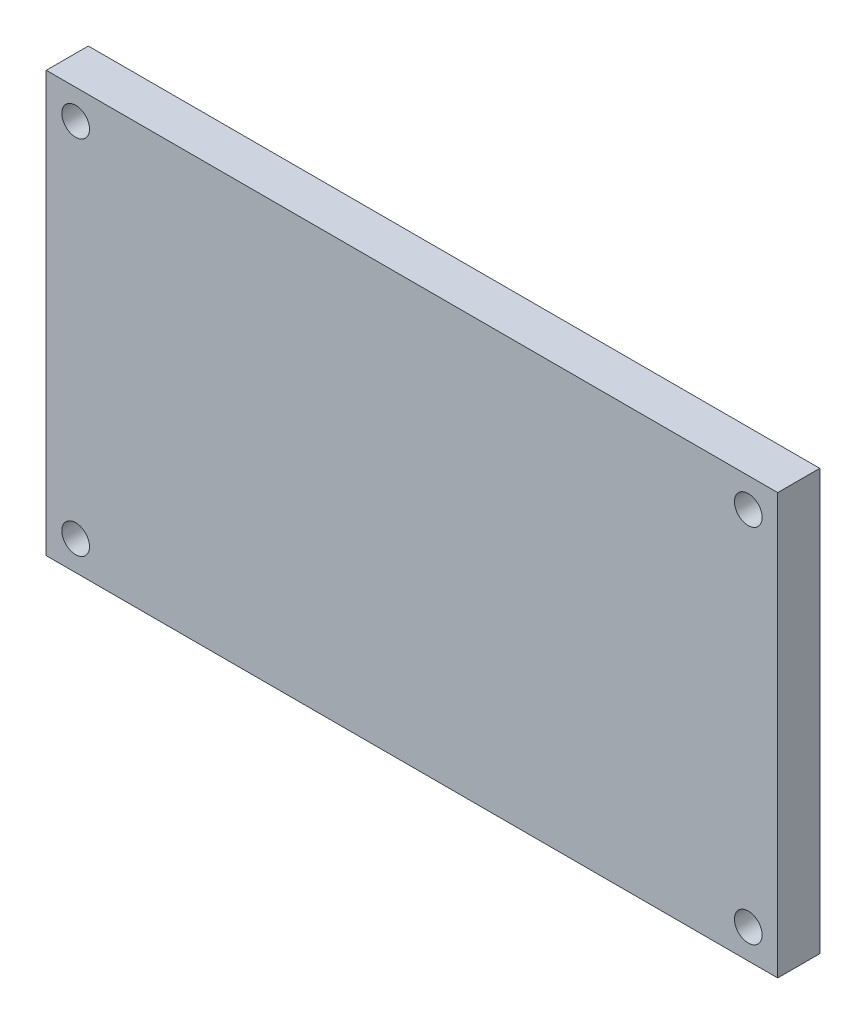
ISO-10303-21;
HEADER;
FILE_DESCRIPTION(('STEP AP214'),'2;1');
FILE_NAME('part.step','',(''),(''),'','','');
FILE_SCHEMA(('AUTOMOTIVE_DESIGN { 1 0 10303 214 1 1 1 1 }'));
ENDSEC;
DATA;
#1=APPLICATION_CONTEXT('core data for automotive mechanical design processes');
#2=APPLICATION_PROTOCOL_DEFINITION('international standard','automotive_design',2000,#1);
#3=PRODUCT_CONTEXT('',#1,'mechanical');
#4=PRODUCT('Part','Part','',(#3));
#5=PRODUCT_RELATED_PRODUCT_CATEGORY('part','',(#4));
#6=PRODUCT_DEFINITION_FORMATION('','',#4);
#7=PRODUCT_DEFINITION_CONTEXT('part definition',#1,'design');
#8=PRODUCT_DEFINITION('design','',#6,#7);
#9=PRODUCT_DEFINITION_SHAPE('','',#8);
#10=(LENGTH_UNIT() NAMED_UNIT(*) SI_UNIT(.MILLI.,.METRE.));
#11=(NAMED_UNIT(*) PLANE_ANGLE_UNIT() SI_UNIT($,.RADIAN.));
#12=(NAMED_UNIT(*) SI_UNIT($,.STERADIAN.) SOLID_ANGLE_UNIT());
#13=UNCERTAINTY_MEASURE_WITH_UNIT(LENGTH_MEASURE(1.E-05),#10,'distance_accuracy_value','');
#14=(GEOMETRIC_REPRESENTATION_CONTEXT(3) GLOBAL_UNCERTAINTY_ASSIGNED_CONTEXT((#13)) GLOBAL_UNIT_ASSIGNED_CONTEXT((#10,
#11,#12)) REPRESENTATION_CONTEXT('',''));
#15=CARTESIAN_POINT('',(0.,0.,0.));
#16=DIRECTION('',(0.,0.,1.));
#17=DIRECTION('',(1.,0.,0.));
#18=AXIS2_PLACEMENT_3D('',#15,#16,#17);
#19=CARTESIAN_POINT('',(0.,0.,5.));
#20=DIRECTION('',(0.,0.,-1.));
#21=DIRECTION('',(-1.,0.,0.));
#22=AXIS2_PLACEMENT_3D('',#19,#20,#21);
#23=PLANE('',#22);
#24=DIRECTION('',(0.,1.,0.));
#25=VECTOR('',#24,1.);
#26=CARTESIAN_POINT('',(43.5,-25.,5.));
#27=LINE('',#26,#25);
#28=CARTESIAN_POINT('',(43.5,-25.,5.));
#29=VERTEX_POINT('',#28);
#30=CARTESIAN_POINT('',(43.5,25.,5.));
#31=VERTEX_POINT('',#30);
#32=EDGE_CURVE('E96',#29,#31,#27,.T.);
#33=ORIENTED_EDGE('',*,*,#32,.T.);
#34=DIRECTION('',(-1.,0.,0.));
#35=VECTOR('',#34,1.);
#36=CARTESIAN_POINT('',(-43.5,25.,5.));
#37=LINE('',#36,#35);
#38=CARTESIAN_POINT('',(-43.5,25.,5.));
#39=VERTEX_POINT('',#38);
#40=EDGE_CURVE('E91',#31,#39,#37,.T.);
#41=ORIENTED_EDGE('',*,*,#40,.T.);
#42=DIRECTION('',(0.,-1.,0.));
#43=VECTOR('',#42,1.);
#44=CARTESIAN_POINT('',(-43.5,-25.,5.));
#45=LINE('',#44,#43);
#46=CARTESIAN_POINT('',(-43.5,-25.,5.));
#47=VERTEX_POINT('',#46);
#48=EDGE_CURVE('E94',#39,#47,#45,.T.);
#49=ORIENTED_EDGE('',*,*,#48,.T.);
#50=DIRECTION('',(1.,0.,0.));
#51=VECTOR('',#50,1.);
#52=CARTESIAN_POINT('',(-43.5,-25.,5.));
#53=LINE('',#52,#51);
#54=EDGE_CURVE('E61',#47,#29,#53,.T.);
#55=ORIENTED_EDGE('',*,*,#54,.T.);
#56=EDGE_LOOP('',(#33,#41,#49,#55));
#57=FACE_BOUND('',#56,.T.);
#58=CARTESIAN_POINT('',(40.,21.5,5.));
#59=DIRECTION('',(0.,0.,1.));
#60=DIRECTION('',(1.,0.,0.));
#61=AXIS2_PLACEMENT_3D('',#58,#59,#60);
#62=CIRCLE('',#61,1.65);
#63=CARTESIAN_POINT('',(41.65,21.5,5.));
#64=VERTEX_POINT('',#63);
#65=EDGE_CURVE('E116',#64,#64,#62,.T.);
#66=ORIENTED_EDGE('',*,*,#65,.F.);
#67=EDGE_LOOP('',(#66));
#68=FACE_BOUND('',#67,.T.);
#69=CARTESIAN_POINT('',(40.,-21.5,5.));
#70=DIRECTION('',(0.,0.,1.));
#71=DIRECTION('',(1.,0.,0.));
#72=AXIS2_PLACEMENT_3D('',#69,#70,#71);
#73=CIRCLE('',#72,1.65);
#74=CARTESIAN_POINT('',(41.65,-21.5,5.));
#75=VERTEX_POINT('',#74);
#76=EDGE_CURVE('E138',#75,#75,#73,.T.);
#77=ORIENTED_EDGE('',*,*,#76,.F.);
#78=EDGE_LOOP('',(#77));
#79=FACE_BOUND('',#78,.T.);
#80=CARTESIAN_POINT('',(-40.,-21.5,5.));
#81=DIRECTION('',(0.,0.,1.));
#82=DIRECTION('',(1.,0.,0.));
#83=AXIS2_PLACEMENT_3D('',#80,#81,#82);
#84=CIRCLE('',#83,1.65);
#85=CARTESIAN_POINT('',(-38.35,-21.5,5.));
#86=VERTEX_POINT('',#85);
#87=EDGE_CURVE('E146',#86,#86,#84,.T.);
#88=ORIENTED_EDGE('',*,*,#87,.F.);
#89=EDGE_LOOP('',(#88));
#90=FACE_BOUND('',#89,.T.);
#91=CARTESIAN_POINT('',(-40.,21.5,5.));
#92=DIRECTION('',(0.,0.,1.));
#93=DIRECTION('',(1.,0.,0.));
#94=AXIS2_PLACEMENT_3D('',#91,#92,#93);
#95=CIRCLE('',#94,1.65);
#96=CARTESIAN_POINT('',(-38.35,21.5,5.));
#97=VERTEX_POINT('',#96);
#98=EDGE_CURVE('E154',#97,#97,#95,.T.);
#99=ORIENTED_EDGE('',*,*,#98,.F.);
#100=EDGE_LOOP('',(#99));
#101=FACE_BOUND('',#100,.T.);
#102=ADVANCED_FACE('F43',(#57,#68,#79,#90,#101),#23,.F.);
#103=CARTESIAN_POINT('',(0.,0.,0.));
#104=DIRECTION('',(0.,0.,-1.));
#105=DIRECTION('',(-1.,0.,0.));
#106=AXIS2_PLACEMENT_3D('',#103,#104,#105);
#107=PLANE('',#106);
#108=CARTESIAN_POINT('',(-40.,-21.5,0.));
#109=DIRECTION('',(0.,0.,1.));
#110=DIRECTION('',(1.,0.,0.));
#111=AXIS2_PLACEMENT_3D('',#108,#109,#110);
#112=CIRCLE('',#111,1.65);
#113=CARTESIAN_POINT('',(-38.35,-21.5,0.));
#114=VERTEX_POINT('',#113);
#115=EDGE_CURVE('E150',#114,#114,#112,.T.);
#116=ORIENTED_EDGE('',*,*,#115,.T.);
#117=EDGE_LOOP('',(#116));
#118=FACE_BOUND('',#117,.T.);
#119=CARTESIAN_POINT('',(40.,21.5,0.));
#120=DIRECTION('',(0.,0.,1.));
#121=DIRECTION('',(1.,0.,0.));
#122=AXIS2_PLACEMENT_3D('',#119,#120,#121);
#123=CIRCLE('',#122,1.65);
#124=CARTESIAN_POINT('',(41.65,21.5,0.));
#125=VERTEX_POINT('',#124);
#126=EDGE_CURVE('E134',#125,#125,#123,.T.);
#127=ORIENTED_EDGE('',*,*,#126,.T.);
#128=EDGE_LOOP('',(#127));
#129=FACE_BOUND('',#128,.T.);
#130=DIRECTION('',(0.,1.,0.));
#131=VECTOR('',#130,1.);
#132=CARTESIAN_POINT('',(43.5,-25.,0.));
#133=LINE('',#132,#131);
#134=CARTESIAN_POINT('',(43.5,-25.,0.));
#135=VERTEX_POINT('',#134);
#136=CARTESIAN_POINT('',(43.5,25.,0.));
#137=VERTEX_POINT('',#136);
#138=EDGE_CURVE('E112',#135,#137,#133,.T.);
#139=ORIENTED_EDGE('',*,*,#138,.F.);
#140=DIRECTION('',(1.,0.,0.));
#141=VECTOR('',#140,1.);
#142=CARTESIAN_POINT('',(-43.5,-25.,0.));
#143=LINE('',#142,#141);
#144=CARTESIAN_POINT('',(-43.5,-25.,0.));
#145=VERTEX_POINT('',#144);
#146=EDGE_CURVE('E84',#145,#135,#143,.T.);
#147=ORIENTED_EDGE('',*,*,#146,.F.);
#148=DIRECTION('',(0.,-1.,0.));
#149=VECTOR('',#148,1.);
#150=CARTESIAN_POINT('',(-43.5,-25.,0.));
#151=LINE('',#150,#149);
#152=CARTESIAN_POINT('',(-43.5,25.,0.));
#153=VERTEX_POINT('',#152);
#154=EDGE_CURVE('E78',#153,#145,#151,.T.);
#155=ORIENTED_EDGE('',*,*,#154,.F.);
#156=DIRECTION('',(-1.,0.,0.));
#157=VECTOR('',#156,1.);
#158=CARTESIAN_POINT('',(-43.5,25.,0.));
#159=LINE('',#158,#157);
#160=EDGE_CURVE('E101',#137,#153,#159,.T.);
#161=ORIENTED_EDGE('',*,*,#160,.F.);
#162=EDGE_LOOP('',(#139,#147,#155,#161));
#163=FACE_BOUND('',#162,.T.);
#164=CARTESIAN_POINT('',(40.,-21.5,0.));
#165=DIRECTION('',(0.,0.,1.));
#166=DIRECTION('',(1.,0.,0.));
#167=AXIS2_PLACEMENT_3D('',#164,#165,#166);
#168=CIRCLE('',#167,1.65);
#169=CARTESIAN_POINT('',(41.65,-21.5,0.));
#170=VERTEX_POINT('',#169);
#171=EDGE_CURVE('E142',#170,#170,#168,.T.);
#172=ORIENTED_EDGE('',*,*,#171,.T.);
#173=EDGE_LOOP('',(#172));
#174=FACE_BOUND('',#173,.T.);
#175=CARTESIAN_POINT('',(-40.,21.5,0.));
#176=DIRECTION('',(0.,0.,1.));
#177=DIRECTION('',(1.,0.,0.));
#178=AXIS2_PLACEMENT_3D('',#175,#176,#177);
#179=CIRCLE('',#178,1.65);
#180=CARTESIAN_POINT('',(-38.35,21.5,0.));
#181=VERTEX_POINT('',#180);
#182=EDGE_CURVE('E158',#181,#181,#179,.T.);
#183=ORIENTED_EDGE('',*,*,#182,.T.);
#184=EDGE_LOOP('',(#183));
#185=FACE_BOUND('',#184,.T.);
#186=ADVANCED_FACE('F129',(#118,#129,#163,#174,#185),#107,.T.);
#187=CARTESIAN_POINT('',(43.5,-25.,5.));
#188=DIRECTION('',(-1.,0.,0.));
#189=DIRECTION('',(0.,0.,1.));
#190=AXIS2_PLACEMENT_3D('',#187,#188,#189);
#191=PLANE('',#190);
#192=ORIENTED_EDGE('',*,*,#138,.T.);
#193=DIRECTION('',(0.,0.,-1.));
#194=VECTOR('',#193,1.);
#195=CARTESIAN_POINT('',(43.5,25.,5.));
#196=LINE('',#195,#194);
#197=EDGE_CURVE('E11',#31,#137,#196,.T.);
#198=ORIENTED_EDGE('',*,*,#197,.F.);
#199=ORIENTED_EDGE('',*,*,#32,.F.);
#200=DIRECTION('',(0.,0.,-1.));
#201=VECTOR('',#200,1.);
#202=CARTESIAN_POINT('',(43.5,-25.,5.));
#203=LINE('',#202,#201);
#204=EDGE_CURVE('E108',#29,#135,#203,.T.);
#205=ORIENTED_EDGE('',*,*,#204,.T.);
#206=EDGE_LOOP('',(#192,#198,#199,#205));
#207=FACE_BOUND('',#206,.T.);
#208=ADVANCED_FACE('F45',(#207),#191,.F.);
#209=CARTESIAN_POINT('',(-43.5,25.,5.));
#210=DIRECTION('',(0.,-1.,0.));
#211=DIRECTION('',(0.,0.,-1.));
#212=AXIS2_PLACEMENT_3D('',#209,#210,#211);
#213=PLANE('',#212);
#214=ORIENTED_EDGE('',*,*,#160,.T.);
#215=DIRECTION('',(0.,0.,-1.));
#216=VECTOR('',#215,1.);
#217=CARTESIAN_POINT('',(-43.5,25.,5.));
#218=LINE('',#217,#216);
#219=EDGE_CURVE('E53',#39,#153,#218,.T.);
#220=ORIENTED_EDGE('',*,*,#219,.F.);
#221=ORIENTED_EDGE('',*,*,#40,.F.);
#222=ORIENTED_EDGE('',*,*,#197,.T.);
#223=EDGE_LOOP('',(#214,#220,#221,#222));
#224=FACE_BOUND('',#223,.T.);
#225=ADVANCED_FACE('F100',(#224),#213,.F.);
#226=CARTESIAN_POINT('',(-43.5,-25.,5.));
#227=DIRECTION('',(1.,0.,0.));
#228=DIRECTION('',(0.,0.,-1.));
#229=AXIS2_PLACEMENT_3D('',#226,#227,#228);
#230=PLANE('',#229);
#231=ORIENTED_EDGE('',*,*,#154,.T.);
#232=DIRECTION('',(0.,0.,-1.));
#233=VECTOR('',#232,1.);
#234=CARTESIAN_POINT('',(-43.5,-25.,5.));
#235=LINE('',#234,#233);
#236=EDGE_CURVE('E103',#47,#145,#235,.T.);
#237=ORIENTED_EDGE('',*,*,#236,.F.);
#238=ORIENTED_EDGE('',*,*,#48,.F.);
#239=ORIENTED_EDGE('',*,*,#219,.T.);
#240=EDGE_LOOP('',(#231,#237,#238,#239));
#241=FACE_BOUND('',#240,.T.);
#242=ADVANCED_FACE('F104',(#241),#230,.F.);
#243=CARTESIAN_POINT('',(-43.5,-25.,5.));
#244=DIRECTION('',(0.,1.,0.));
#245=DIRECTION('',(0.,0.,1.));
#246=AXIS2_PLACEMENT_3D('',#243,#244,#245);
#247=PLANE('',#246);
#248=ORIENTED_EDGE('',*,*,#146,.T.);
#249=ORIENTED_EDGE('',*,*,#204,.F.);
#250=ORIENTED_EDGE('',*,*,#54,.F.);
#251=ORIENTED_EDGE('',*,*,#236,.T.);
#252=EDGE_LOOP('',(#248,#249,#250,#251));
#253=FACE_BOUND('',#252,.T.);
#254=ADVANCED_FACE('F126',(#253),#247,.F.);
#255=CARTESIAN_POINT('',(40.,21.5,5.));
#256=DIRECTION('',(0.,0.,-1.));
#257=DIRECTION('',(-1.,0.,0.));
#258=AXIS2_PLACEMENT_3D('',#255,#256,#257);
#259=CYLINDRICAL_SURFACE('',#258,1.65);
#260=ORIENTED_EDGE('',*,*,#65,.T.);
#261=EDGE_LOOP('',(#260));
#262=FACE_BOUND('',#261,.T.);
#263=ORIENTED_EDGE('',*,*,#126,.F.);
#264=EDGE_LOOP('',(#263));
#265=FACE_BOUND('',#264,.T.);
#266=ADVANCED_FACE('F177',(#262,#265),#259,.F.);
#267=CARTESIAN_POINT('',(40.,-21.5,5.));
#268=DIRECTION('',(0.,0.,-1.));
#269=DIRECTION('',(-1.,0.,0.));
#270=AXIS2_PLACEMENT_3D('',#267,#268,#269);
#271=CYLINDRICAL_SURFACE('',#270,1.65);
#272=ORIENTED_EDGE('',*,*,#76,.T.);
#273=EDGE_LOOP('',(#272));
#274=FACE_BOUND('',#273,.T.);
#275=ORIENTED_EDGE('',*,*,#171,.F.);
#276=EDGE_LOOP('',(#275));
#277=FACE_BOUND('',#276,.T.);
#278=ADVANCED_FACE('F231',(#274,#277),#271,.F.);
#279=CARTESIAN_POINT('',(-40.,-21.5,5.));
#280=DIRECTION('',(0.,0.,-1.));
#281=DIRECTION('',(-1.,0.,0.));
#282=AXIS2_PLACEMENT_3D('',#279,#280,#281);
#283=CYLINDRICAL_SURFACE('',#282,1.65);
#284=ORIENTED_EDGE('',*,*,#87,.T.);
#285=EDGE_LOOP('',(#284));
#286=FACE_BOUND('',#285,.T.);
#287=ORIENTED_EDGE('',*,*,#115,.F.);
#288=EDGE_LOOP('',(#287));
#289=FACE_BOUND('',#288,.T.);
#290=ADVANCED_FACE('F240',(#286,#289),#283,.F.);
#291=CARTESIAN_POINT('',(-40.,21.5,5.));
#292=DIRECTION('',(0.,0.,-1.));
#293=DIRECTION('',(-1.,0.,0.));
#294=AXIS2_PLACEMENT_3D('',#291,#292,#293);
#295=CYLINDRICAL_SURFACE('',#294,1.65);
#296=ORIENTED_EDGE('',*,*,#98,.T.);
#297=EDGE_LOOP('',(#296));
#298=FACE_BOUND('',#297,.T.);
#299=ORIENTED_EDGE('',*,*,#182,.F.);
#300=EDGE_LOOP('',(#299));
#301=FACE_BOUND('',#300,.T.);
#302=ADVANCED_FACE('F166',(#298,#301),#295,.F.);
#303=CLOSED_SHELL('',(#102,#186,#208,#225,#242,#254,#266,#278,#290,#302));
#304=MANIFOLD_SOLID_BREP('B2',#303);
#305=ADVANCED_BREP_SHAPE_REPRESENTATION('',(#18,#304),#14);
#306=SHAPE_DEFINITION_REPRESENTATION(#9,#305);
ENDSEC;
END-ISO-10303-21;
